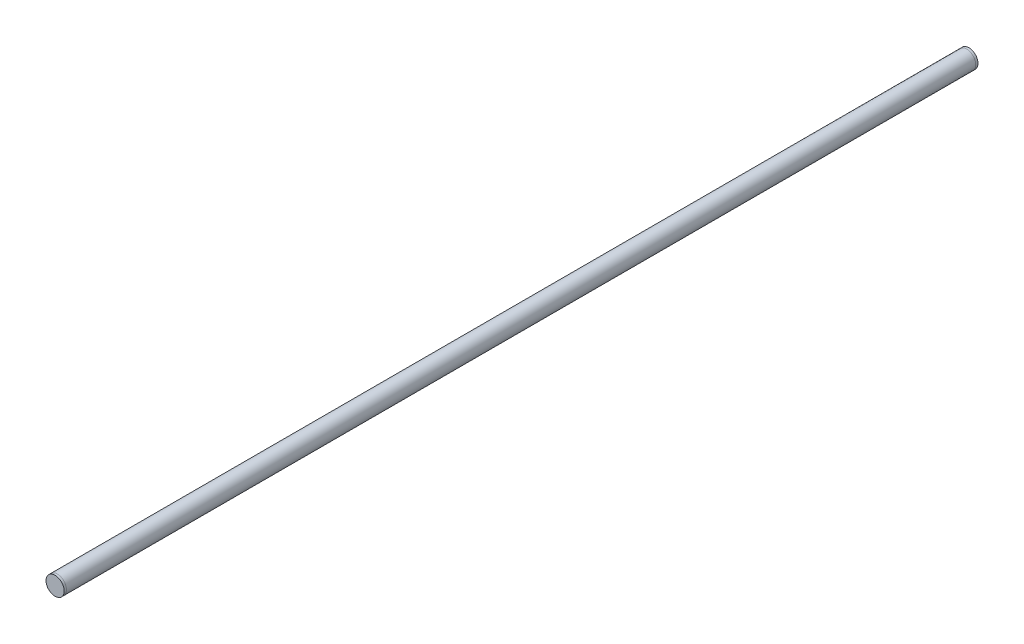
ISO-10303-21;
HEADER;
FILE_DESCRIPTION(('STEP AP214'),'2;1');
FILE_NAME('part.step','',(''),(''),'','','');
FILE_SCHEMA(('AUTOMOTIVE_DESIGN { 1 0 10303 214 1 1 1 1 }'));
ENDSEC;
DATA;
#1=APPLICATION_CONTEXT('core data for automotive mechanical design processes');
#2=APPLICATION_PROTOCOL_DEFINITION('international standard','automotive_design',2000,#1);
#3=PRODUCT_CONTEXT('',#1,'mechanical');
#4=PRODUCT('Part','Part','',(#3));
#5=PRODUCT_RELATED_PRODUCT_CATEGORY('part','',(#4));
#6=PRODUCT_DEFINITION_FORMATION('','',#4);
#7=PRODUCT_DEFINITION_CONTEXT('part definition',#1,'design');
#8=PRODUCT_DEFINITION('design','',#6,#7);
#9=PRODUCT_DEFINITION_SHAPE('','',#8);
#10=(LENGTH_UNIT() NAMED_UNIT(*) SI_UNIT(.MILLI.,.METRE.));
#11=(NAMED_UNIT(*) PLANE_ANGLE_UNIT() SI_UNIT($,.RADIAN.));
#12=(NAMED_UNIT(*) SI_UNIT($,.STERADIAN.) SOLID_ANGLE_UNIT());
#13=UNCERTAINTY_MEASURE_WITH_UNIT(LENGTH_MEASURE(1.E-05),#10,'distance_accuracy_value','');
#14=(GEOMETRIC_REPRESENTATION_CONTEXT(3) GLOBAL_UNCERTAINTY_ASSIGNED_CONTEXT((#13)) GLOBAL_UNIT_ASSIGNED_CONTEXT((#10,
#11,#12)) REPRESENTATION_CONTEXT('',''));
#15=CARTESIAN_POINT('',(0.,0.,0.));
#16=DIRECTION('',(0.,0.,1.));
#17=DIRECTION('',(1.,0.,0.));
#18=AXIS2_PLACEMENT_3D('',#15,#16,#17);
#19=CARTESIAN_POINT('',(0.,0.,401.));
#20=DIRECTION('',(0.,0.,-1.));
#21=DIRECTION('',(-1.,0.,0.));
#22=AXIS2_PLACEMENT_3D('',#19,#20,#21);
#23=CYLINDRICAL_SURFACE('',#22,4.);
#24=CARTESIAN_POINT('',(0.,0.,401.));
#25=DIRECTION('',(0.,0.,1.));
#26=DIRECTION('',(1.,0.,0.));
#27=AXIS2_PLACEMENT_3D('',#24,#25,#26);
#28=CIRCLE('',#27,4.);
#29=CARTESIAN_POINT('',(4.,0.,401.));
#30=VERTEX_POINT('',#29);
#31=EDGE_CURVE('E11',#30,#30,#28,.T.);
#32=ORIENTED_EDGE('',*,*,#31,.F.);
#33=EDGE_LOOP('',(#32));
#34=FACE_BOUND('',#33,.T.);
#35=CARTESIAN_POINT('',(0.,0.,400.));
#36=DIRECTION('',(0.,0.,1.));
#37=DIRECTION('',(1.,0.,0.));
#38=AXIS2_PLACEMENT_3D('',#35,#36,#37);
#39=CIRCLE('',#38,4.);
#40=CARTESIAN_POINT('',(4.,0.,400.));
#41=VERTEX_POINT('',#40);
#42=EDGE_CURVE('E44',#41,#41,#39,.T.);
#43=ORIENTED_EDGE('',*,*,#42,.T.);
#44=EDGE_LOOP('',(#43));
#45=FACE_BOUND('',#44,.T.);
#46=ADVANCED_FACE('F41',(#34,#45),#23,.T.);
#47=CARTESIAN_POINT('',(0.,0.,401.));
#48=DIRECTION('',(0.,0.,1.));
#49=DIRECTION('',(1.,0.,0.));
#50=AXIS2_PLACEMENT_3D('',#47,#48,#49);
#51=PLANE('',#50);
#52=ORIENTED_EDGE('',*,*,#31,.T.);
#53=EDGE_LOOP('',(#52));
#54=FACE_BOUND('',#53,.T.);
#55=ADVANCED_FACE('F56',(#54),#51,.T.);
#56=CARTESIAN_POINT('',(0.,0.,400.));
#57=DIRECTION('',(0.,0.,1.));
#58=DIRECTION('',(1.,0.,0.));
#59=AXIS2_PLACEMENT_3D('',#56,#57,#58);
#60=PLANE('',#59);
#61=ORIENTED_EDGE('',*,*,#42,.F.);
#62=EDGE_LOOP('',(#61));
#63=FACE_BOUND('',#62,.T.);
#64=ADVANCED_FACE('F54',(#63),#60,.F.);
#65=CLOSED_SHELL('',(#46,#55,#64));
#66=MANIFOLD_SOLID_BREP('B2',#65);
#67=CARTESIAN_POINT('',(0.,0.,-1.));
#68=DIRECTION('',(0.,0.,1.));
#69=DIRECTION('',(1.,0.,0.));
#70=AXIS2_PLACEMENT_3D('',#67,#68,#69);
#71=CYLINDRICAL_SURFACE('',#70,4.);
#72=CARTESIAN_POINT('',(0.,0.,-1.));
#73=DIRECTION('',(0.,0.,-1.));
#74=DIRECTION('',(-1.,0.,0.));
#75=AXIS2_PLACEMENT_3D('',#72,#73,#74);
#76=CIRCLE('',#75,4.);
#77=CARTESIAN_POINT('',(-4.,0.,-1.));
#78=VERTEX_POINT('',#77);
#79=EDGE_CURVE('E40',#78,#78,#76,.T.);
#80=ORIENTED_EDGE('',*,*,#79,.F.);
#81=EDGE_LOOP('',(#80));
#82=FACE_BOUND('',#81,.T.);
#83=CARTESIAN_POINT('',(0.,0.,0.));
#84=DIRECTION('',(0.,0.,-1.));
#85=DIRECTION('',(-1.,0.,0.));
#86=AXIS2_PLACEMENT_3D('',#83,#84,#85);
#87=CIRCLE('',#86,4.);
#88=CARTESIAN_POINT('',(-4.,0.,0.));
#89=VERTEX_POINT('',#88);
#90=EDGE_CURVE('E91',#89,#89,#87,.T.);
#91=ORIENTED_EDGE('',*,*,#90,.T.);
#92=EDGE_LOOP('',(#91));
#93=FACE_BOUND('',#92,.T.);
#94=ADVANCED_FACE('F88',(#82,#93),#71,.T.);
#95=CARTESIAN_POINT('',(0.,0.,-1.));
#96=DIRECTION('',(0.,0.,-1.));
#97=DIRECTION('',(-1.,0.,0.));
#98=AXIS2_PLACEMENT_3D('',#95,#96,#97);
#99=PLANE('',#98);
#100=ORIENTED_EDGE('',*,*,#79,.T.);
#101=EDGE_LOOP('',(#100));
#102=FACE_BOUND('',#101,.T.);
#103=ADVANCED_FACE('F103',(#102),#99,.T.);
#104=CARTESIAN_POINT('',(0.,0.,0.));
#105=DIRECTION('',(0.,0.,-1.));
#106=DIRECTION('',(-1.,0.,0.));
#107=AXIS2_PLACEMENT_3D('',#104,#105,#106);
#108=PLANE('',#107);
#109=ORIENTED_EDGE('',*,*,#90,.F.);
#110=EDGE_LOOP('',(#109));
#111=FACE_BOUND('',#110,.T.);
#112=ADVANCED_FACE('F101',(#111),#108,.F.);
#113=CLOSED_SHELL('',(#94,#103,#112));
#114=MANIFOLD_SOLID_BREP('B6',#113);
#115=CARTESIAN_POINT('',(0.,0.,400.));
#116=DIRECTION('',(0.,0.,-1.));
#117=DIRECTION('',(-1.,0.,0.));
#118=AXIS2_PLACEMENT_3D('',#115,#116,#117);
#119=CYLINDRICAL_SURFACE('',#118,4.);
#120=CARTESIAN_POINT('',(0.,0.,400.));
#121=DIRECTION('',(0.,0.,1.));
#122=DIRECTION('',(1.,0.,0.));
#123=AXIS2_PLACEMENT_3D('',#120,#121,#122);
#124=CIRCLE('',#123,4.);
#125=CARTESIAN_POINT('',(4.,0.,400.));
#126=VERTEX_POINT('',#125);
#127=EDGE_CURVE('E87',#126,#126,#124,.T.);
#128=ORIENTED_EDGE('',*,*,#127,.F.);
#129=EDGE_LOOP('',(#128));
#130=FACE_BOUND('',#129,.T.);
#131=CARTESIAN_POINT('',(0.,0.,0.));
#132=DIRECTION('',(0.,0.,1.));
#133=DIRECTION('',(1.,0.,0.));
#134=AXIS2_PLACEMENT_3D('',#131,#132,#133);
#135=CIRCLE('',#134,4.);
#136=CARTESIAN_POINT('',(4.,0.,0.));
#137=VERTEX_POINT('',#136);
#138=EDGE_CURVE('E131',#137,#137,#135,.T.);
#139=ORIENTED_EDGE('',*,*,#138,.T.);
#140=EDGE_LOOP('',(#139));
#141=FACE_BOUND('',#140,.T.);
#142=ADVANCED_FACE('F128',(#130,#141),#119,.T.);
#143=CARTESIAN_POINT('',(0.,0.,400.));
#144=DIRECTION('',(0.,0.,1.));
#145=DIRECTION('',(1.,0.,0.));
#146=AXIS2_PLACEMENT_3D('',#143,#144,#145);
#147=PLANE('',#146);
#148=ORIENTED_EDGE('',*,*,#127,.T.);
#149=EDGE_LOOP('',(#148));
#150=FACE_BOUND('',#149,.T.);
#151=ADVANCED_FACE('F143',(#150),#147,.T.);
#152=CARTESIAN_POINT('',(0.,0.,0.));
#153=DIRECTION('',(0.,0.,1.));
#154=DIRECTION('',(1.,0.,0.));
#155=AXIS2_PLACEMENT_3D('',#152,#153,#154);
#156=PLANE('',#155);
#157=ORIENTED_EDGE('',*,*,#138,.F.);
#158=EDGE_LOOP('',(#157));
#159=FACE_BOUND('',#158,.T.);
#160=ADVANCED_FACE('F141',(#159),#156,.F.);
#161=CLOSED_SHELL('',(#142,#151,#160));
#162=MANIFOLD_SOLID_BREP('B35',#161);
#163=ADVANCED_BREP_SHAPE_REPRESENTATION('',(#18,#66,#114,#162),#14);
#164=SHAPE_DEFINITION_REPRESENTATION(#9,#163);
ENDSEC;
END-ISO-10303-21;
